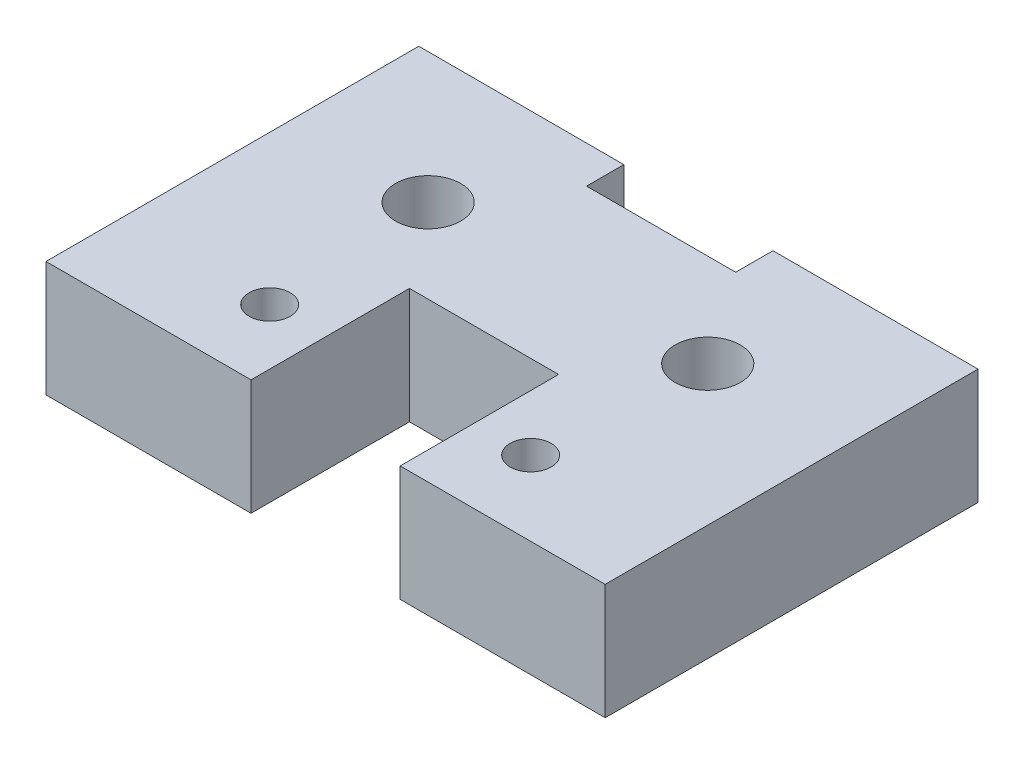
ISO-10303-21;
HEADER;
FILE_DESCRIPTION(('STEP AP214'),'2;1');
FILE_NAME('part.step','',(''),(''),'','','');
FILE_SCHEMA(('AUTOMOTIVE_DESIGN { 1 0 10303 214 1 1 1 1 }'));
ENDSEC;
DATA;
#1=APPLICATION_CONTEXT('core data for automotive mechanical design processes');
#2=APPLICATION_PROTOCOL_DEFINITION('international standard','automotive_design',2000,#1);
#3=PRODUCT_CONTEXT('',#1,'mechanical');
#4=PRODUCT('Part','Part','',(#3));
#5=PRODUCT_RELATED_PRODUCT_CATEGORY('part','',(#4));
#6=PRODUCT_DEFINITION_FORMATION('','',#4);
#7=PRODUCT_DEFINITION_CONTEXT('part definition',#1,'design');
#8=PRODUCT_DEFINITION('design','',#6,#7);
#9=PRODUCT_DEFINITION_SHAPE('','',#8);
#10=(LENGTH_UNIT() NAMED_UNIT(*) SI_UNIT(.MILLI.,.METRE.));
#11=(NAMED_UNIT(*) PLANE_ANGLE_UNIT() SI_UNIT($,.RADIAN.));
#12=(NAMED_UNIT(*) SI_UNIT($,.STERADIAN.) SOLID_ANGLE_UNIT());
#13=UNCERTAINTY_MEASURE_WITH_UNIT(LENGTH_MEASURE(1.E-05),#10,'distance_accuracy_value','');
#14=(GEOMETRIC_REPRESENTATION_CONTEXT(3) GLOBAL_UNCERTAINTY_ASSIGNED_CONTEXT((#13)) GLOBAL_UNIT_ASSIGNED_CONTEXT((#10,
#11,#12)) REPRESENTATION_CONTEXT('',''));
#15=CARTESIAN_POINT('',(0.,0.,0.));
#16=DIRECTION('',(0.,0.,1.));
#17=DIRECTION('',(1.,0.,0.));
#18=AXIS2_PLACEMENT_3D('',#15,#16,#17);
#19=CARTESIAN_POINT('',(0.,0.,0.));
#20=DIRECTION('',(0.,-1.,0.));
#21=DIRECTION('',(0.,0.,-1.));
#22=AXIS2_PLACEMENT_3D('',#19,#20,#21);
#23=PLANE('',#22);
#24=CARTESIAN_POINT('',(-7.,0.,6.));
#25=DIRECTION('',(0.,1.,0.));
#26=DIRECTION('',(0.,0.,1.));
#27=AXIS2_PLACEMENT_3D('',#24,#25,#26);
#28=CIRCLE('',#27,1.1);
#29=CARTESIAN_POINT('',(-7.,0.,7.1));
#30=VERTEX_POINT('',#29);
#31=EDGE_CURVE('E182',#30,#30,#28,.T.);
#32=ORIENTED_EDGE('',*,*,#31,.T.);
#33=EDGE_LOOP('',(#32));
#34=FACE_BOUND('',#33,.T.);
#35=CARTESIAN_POINT('',(7.,0.,6.));
#36=DIRECTION('',(0.,1.,0.));
#37=DIRECTION('',(0.,0.,-1.));
#38=AXIS2_PLACEMENT_3D('',#35,#36,#37);
#39=CIRCLE('',#38,1.1);
#40=CARTESIAN_POINT('',(7.,0.,4.9));
#41=VERTEX_POINT('',#40);
#42=EDGE_CURVE('E177',#41,#41,#39,.T.);
#43=ORIENTED_EDGE('',*,*,#42,.T.);
#44=EDGE_LOOP('',(#43));
#45=FACE_BOUND('',#44,.T.);
#46=DIRECTION('',(0.,0.,-1.));
#47=VECTOR('',#46,1.);
#48=CARTESIAN_POINT('',(4.,0.,-8.));
#49=LINE('',#48,#47);
#50=CARTESIAN_POINT('',(4.,0.,-8.));
#51=VERTEX_POINT('',#50);
#52=CARTESIAN_POINT('',(4.,0.,-10.));
#53=VERTEX_POINT('',#52);
#54=EDGE_CURVE('E191',#51,#53,#49,.T.);
#55=ORIENTED_EDGE('',*,*,#54,.T.);
#56=DIRECTION('',(-1.,0.,0.));
#57=VECTOR('',#56,1.);
#58=CARTESIAN_POINT('',(-15.,0.,-10.));
#59=LINE('',#58,#57);
#60=CARTESIAN_POINT('',(15.,0.,-10.));
#61=VERTEX_POINT('',#60);
#62=EDGE_CURVE('E272',#61,#53,#59,.T.);
#63=ORIENTED_EDGE('',*,*,#62,.F.);
#64=DIRECTION('',(0.,0.,-1.));
#65=VECTOR('',#64,1.);
#66=CARTESIAN_POINT('',(15.,0.,10.));
#67=LINE('',#66,#65);
#68=CARTESIAN_POINT('',(15.,0.,10.));
#69=VERTEX_POINT('',#68);
#70=EDGE_CURVE('E266',#69,#61,#67,.T.);
#71=ORIENTED_EDGE('',*,*,#70,.F.);
#72=DIRECTION('',(1.,0.,0.));
#73=VECTOR('',#72,1.);
#74=CARTESIAN_POINT('',(-15.,0.,10.));
#75=LINE('',#74,#73);
#76=CARTESIAN_POINT('',(4.,0.,10.));
#77=VERTEX_POINT('',#76);
#78=EDGE_CURVE('E277',#77,#69,#75,.T.);
#79=ORIENTED_EDGE('',*,*,#78,.F.);
#80=DIRECTION('',(0.,0.,-1.));
#81=VECTOR('',#80,1.);
#82=CARTESIAN_POINT('',(4.,0.,1.5));
#83=LINE('',#82,#81);
#84=CARTESIAN_POINT('',(4.,0.,1.5));
#85=VERTEX_POINT('',#84);
#86=EDGE_CURVE('E245',#77,#85,#83,.T.);
#87=ORIENTED_EDGE('',*,*,#86,.T.);
#88=DIRECTION('',(-1.,0.,0.));
#89=VECTOR('',#88,1.);
#90=CARTESIAN_POINT('',(-4.,0.,1.5));
#91=LINE('',#90,#89);
#92=CARTESIAN_POINT('',(-4.,0.,1.5));
#93=VERTEX_POINT('',#92);
#94=EDGE_CURVE('E248',#85,#93,#91,.T.);
#95=ORIENTED_EDGE('',*,*,#94,.T.);
#96=DIRECTION('',(0.,0.,1.));
#97=VECTOR('',#96,1.);
#98=CARTESIAN_POINT('',(-4.,0.,1.5));
#99=LINE('',#98,#97);
#100=CARTESIAN_POINT('',(-4.,0.,10.));
#101=VERTEX_POINT('',#100);
#102=EDGE_CURVE('E251',#93,#101,#99,.T.);
#103=ORIENTED_EDGE('',*,*,#102,.T.);
#104=CARTESIAN_POINT('',(-15.,0.,10.));
#105=VERTEX_POINT('',#104);
#106=EDGE_CURVE('E278',#105,#101,#75,.T.);
#107=ORIENTED_EDGE('',*,*,#106,.F.);
#108=DIRECTION('',(0.,0.,1.));
#109=VECTOR('',#108,1.);
#110=CARTESIAN_POINT('',(-15.,0.,10.));
#111=LINE('',#110,#109);
#112=CARTESIAN_POINT('',(-15.,0.,-10.));
#113=VERTEX_POINT('',#112);
#114=EDGE_CURVE('E275',#113,#105,#111,.T.);
#115=ORIENTED_EDGE('',*,*,#114,.F.);
#116=CARTESIAN_POINT('',(-4.,0.,-10.));
#117=VERTEX_POINT('',#116);
#118=EDGE_CURVE('E271',#117,#113,#59,.T.);
#119=ORIENTED_EDGE('',*,*,#118,.F.);
#120=DIRECTION('',(0.,0.,1.));
#121=VECTOR('',#120,1.);
#122=CARTESIAN_POINT('',(-4.,0.,-8.));
#123=LINE('',#122,#121);
#124=CARTESIAN_POINT('',(-4.,0.,-8.));
#125=VERTEX_POINT('',#124);
#126=EDGE_CURVE('E194',#117,#125,#123,.T.);
#127=ORIENTED_EDGE('',*,*,#126,.T.);
#128=DIRECTION('',(1.,0.,0.));
#129=VECTOR('',#128,1.);
#130=CARTESIAN_POINT('',(-4.,0.,-8.));
#131=LINE('',#130,#129);
#132=EDGE_CURVE('E198',#125,#51,#131,.T.);
#133=ORIENTED_EDGE('',*,*,#132,.T.);
#134=EDGE_LOOP('',(#55,#63,#71,#79,#87,#95,#103,#107,#115,#119,#127,#133));
#135=FACE_BOUND('',#134,.T.);
#136=CARTESIAN_POINT('',(-7.5,0.,-3.));
#137=DIRECTION('',(0.,1.,0.));
#138=DIRECTION('',(0.,0.,1.));
#139=AXIS2_PLACEMENT_3D('',#136,#137,#138);
#140=CIRCLE('',#139,3.05);
#141=CARTESIAN_POINT('',(-7.5,0.,0.0499999999999997));
#142=VERTEX_POINT('',#141);
#143=EDGE_CURVE('E263',#142,#142,#140,.T.);
#144=ORIENTED_EDGE('',*,*,#143,.T.);
#145=EDGE_LOOP('',(#144));
#146=FACE_BOUND('',#145,.T.);
#147=CARTESIAN_POINT('',(7.5,0.,-3.));
#148=DIRECTION('',(0.,1.,0.));
#149=DIRECTION('',(0.,0.,1.));
#150=AXIS2_PLACEMENT_3D('',#147,#148,#149);
#151=CIRCLE('',#150,3.05);
#152=CARTESIAN_POINT('',(7.5,0.,0.0499999999999962));
#153=VERTEX_POINT('',#152);
#154=EDGE_CURVE('E257',#153,#153,#151,.T.);
#155=ORIENTED_EDGE('',*,*,#154,.T.);
#156=EDGE_LOOP('',(#155));
#157=FACE_BOUND('',#156,.T.);
#158=DIRECTION('',(1.,0.,0.));
#159=VECTOR('',#158,1.);
#160=CARTESIAN_POINT('',(1.4,0.,-6.4));
#161=LINE('',#160,#159);
#162=CARTESIAN_POINT('',(-1.4,0.,-6.4));
#163=VERTEX_POINT('',#162);
#164=CARTESIAN_POINT('',(1.4,0.,-6.4));
#165=VERTEX_POINT('',#164);
#166=EDGE_CURVE('E401',#163,#165,#161,.T.);
#167=ORIENTED_EDGE('',*,*,#166,.F.);
#168=DIRECTION('',(0.,0.,-1.));
#169=VECTOR('',#168,1.);
#170=CARTESIAN_POINT('',(-1.4,0.,-3.6));
#171=LINE('',#170,#169);
#172=CARTESIAN_POINT('',(-1.4,0.,-3.6));
#173=VERTEX_POINT('',#172);
#174=EDGE_CURVE('E172',#173,#163,#171,.T.);
#175=ORIENTED_EDGE('',*,*,#174,.F.);
#176=DIRECTION('',(-1.,0.,0.));
#177=VECTOR('',#176,1.);
#178=CARTESIAN_POINT('',(1.4,0.,-3.6));
#179=LINE('',#178,#177);
#180=CARTESIAN_POINT('',(1.4,0.,-3.6));
#181=VERTEX_POINT('',#180);
#182=EDGE_CURVE('E168',#181,#173,#179,.T.);
#183=ORIENTED_EDGE('',*,*,#182,.F.);
#184=DIRECTION('',(0.,0.,1.));
#185=VECTOR('',#184,1.);
#186=CARTESIAN_POINT('',(1.4,0.,-3.6));
#187=LINE('',#186,#185);
#188=EDGE_CURVE('E403',#165,#181,#187,.T.);
#189=ORIENTED_EDGE('',*,*,#188,.F.);
#190=EDGE_LOOP('',(#167,#175,#183,#189));
#191=FACE_BOUND('',#190,.T.);
#192=ADVANCED_FACE('F35',(#34,#45,#135,#146,#157,#191),#23,.T.);
#193=CARTESIAN_POINT('',(-15.,4.2,-10.));
#194=DIRECTION('',(0.,0.,1.));
#195=DIRECTION('',(1.,0.,0.));
#196=AXIS2_PLACEMENT_3D('',#193,#194,#195);
#197=PLANE('',#196);
#198=ORIENTED_EDGE('',*,*,#62,.T.);
#199=DIRECTION('',(0.,1.,0.));
#200=VECTOR('',#199,1.);
#201=CARTESIAN_POINT('',(4.,0.,-10.));
#202=LINE('',#201,#200);
#203=CARTESIAN_POINT('',(4.,6.2,-10.));
#204=VERTEX_POINT('',#203);
#205=EDGE_CURVE('E201',#53,#204,#202,.T.);
#206=ORIENTED_EDGE('',*,*,#205,.T.);
#207=DIRECTION('',(-1.,0.,0.));
#208=VECTOR('',#207,1.);
#209=CARTESIAN_POINT('',(15.,6.2,-10.));
#210=LINE('',#209,#208);
#211=CARTESIAN_POINT('',(15.,6.2,-10.));
#212=VERTEX_POINT('',#211);
#213=EDGE_CURVE('E236',#212,#204,#210,.T.);
#214=ORIENTED_EDGE('',*,*,#213,.F.);
#215=DIRECTION('',(0.,-1.,0.));
#216=VECTOR('',#215,1.);
#217=CARTESIAN_POINT('',(15.,4.2,-10.));
#218=LINE('',#217,#216);
#219=EDGE_CURVE('E11',#212,#61,#218,.T.);
#220=ORIENTED_EDGE('',*,*,#219,.T.);
#221=EDGE_LOOP('',(#198,#206,#214,#220));
#222=FACE_BOUND('',#221,.T.);
#223=ADVANCED_FACE('F307',(#222),#197,.F.);
#224=CARTESIAN_POINT('',(-15.,4.2,10.));
#225=DIRECTION('',(0.,0.,-1.));
#226=DIRECTION('',(-1.,0.,0.));
#227=AXIS2_PLACEMENT_3D('',#224,#225,#226);
#228=PLANE('',#227);
#229=DIRECTION('',(0.,-1.,0.));
#230=VECTOR('',#229,1.);
#231=CARTESIAN_POINT('',(15.,4.2,10.));
#232=LINE('',#231,#230);
#233=CARTESIAN_POINT('',(15.,6.2,10.));
#234=VERTEX_POINT('',#233);
#235=EDGE_CURVE('E281',#234,#69,#232,.T.);
#236=ORIENTED_EDGE('',*,*,#235,.F.);
#237=DIRECTION('',(1.,0.,0.));
#238=VECTOR('',#237,1.);
#239=CARTESIAN_POINT('',(4.,6.2,10.));
#240=LINE('',#239,#238);
#241=CARTESIAN_POINT('',(4.,6.2,10.));
#242=VERTEX_POINT('',#241);
#243=EDGE_CURVE('E229',#242,#234,#240,.T.);
#244=ORIENTED_EDGE('',*,*,#243,.F.);
#245=DIRECTION('',(0.,1.,0.));
#246=VECTOR('',#245,1.);
#247=CARTESIAN_POINT('',(4.,0.,10.));
#248=LINE('',#247,#246);
#249=EDGE_CURVE('E255',#77,#242,#248,.T.);
#250=ORIENTED_EDGE('',*,*,#249,.F.);
#251=ORIENTED_EDGE('',*,*,#78,.T.);
#252=EDGE_LOOP('',(#236,#244,#250,#251));
#253=FACE_BOUND('',#252,.T.);
#254=ADVANCED_FACE('F313',(#253),#228,.F.);
#255=CARTESIAN_POINT('',(15.,4.2,10.));
#256=DIRECTION('',(-1.,0.,0.));
#257=DIRECTION('',(0.,0.,1.));
#258=AXIS2_PLACEMENT_3D('',#255,#256,#257);
#259=PLANE('',#258);
#260=ORIENTED_EDGE('',*,*,#70,.T.);
#261=ORIENTED_EDGE('',*,*,#219,.F.);
#262=DIRECTION('',(0.,0.,-1.));
#263=VECTOR('',#262,1.);
#264=CARTESIAN_POINT('',(15.,6.2,10.));
#265=LINE('',#264,#263);
#266=EDGE_CURVE('E232',#234,#212,#265,.T.);
#267=ORIENTED_EDGE('',*,*,#266,.F.);
#268=ORIENTED_EDGE('',*,*,#235,.T.);
#269=EDGE_LOOP('',(#260,#261,#267,#268));
#270=FACE_BOUND('',#269,.T.);
#271=ADVANCED_FACE('F37',(#270),#259,.F.);
#272=CARTESIAN_POINT('',(-4.,6.2,-10.));
#273=VERTEX_POINT('',#272);
#274=CARTESIAN_POINT('',(-15.,6.2,-10.));
#275=VERTEX_POINT('',#274);
#276=EDGE_CURVE('E235',#273,#275,#210,.T.);
#277=ORIENTED_EDGE('',*,*,#276,.F.);
#278=DIRECTION('',(0.,1.,0.));
#279=VECTOR('',#278,1.);
#280=CARTESIAN_POINT('',(-4.,0.,-10.));
#281=LINE('',#280,#279);
#282=EDGE_CURVE('E58',#117,#273,#281,.T.);
#283=ORIENTED_EDGE('',*,*,#282,.F.);
#284=ORIENTED_EDGE('',*,*,#118,.T.);
#285=DIRECTION('',(0.,-1.,0.));
#286=VECTOR('',#285,1.);
#287=CARTESIAN_POINT('',(-15.,4.2,-10.));
#288=LINE('',#287,#286);
#289=EDGE_CURVE('E43',#275,#113,#288,.T.);
#290=ORIENTED_EDGE('',*,*,#289,.F.);
#291=EDGE_LOOP('',(#277,#283,#284,#290));
#292=FACE_BOUND('',#291,.T.);
#293=ADVANCED_FACE('F305',(#292),#197,.F.);
#294=CARTESIAN_POINT('',(-15.,4.2,10.));
#295=DIRECTION('',(1.,0.,0.));
#296=DIRECTION('',(0.,0.,-1.));
#297=AXIS2_PLACEMENT_3D('',#294,#295,#296);
#298=PLANE('',#297);
#299=ORIENTED_EDGE('',*,*,#114,.T.);
#300=DIRECTION('',(0.,-1.,0.));
#301=VECTOR('',#300,1.);
#302=CARTESIAN_POINT('',(-15.,4.2,10.));
#303=LINE('',#302,#301);
#304=CARTESIAN_POINT('',(-15.,6.2,10.));
#305=VERTEX_POINT('',#304);
#306=EDGE_CURVE('E284',#305,#105,#303,.T.);
#307=ORIENTED_EDGE('',*,*,#306,.F.);
#308=DIRECTION('',(0.,0.,1.));
#309=VECTOR('',#308,1.);
#310=CARTESIAN_POINT('',(-15.,6.2,-10.));
#311=LINE('',#310,#309);
#312=EDGE_CURVE('E239',#275,#305,#311,.T.);
#313=ORIENTED_EDGE('',*,*,#312,.F.);
#314=ORIENTED_EDGE('',*,*,#289,.T.);
#315=EDGE_LOOP('',(#299,#307,#313,#314));
#316=FACE_BOUND('',#315,.T.);
#317=ADVANCED_FACE('F291',(#316),#298,.F.);
#318=ORIENTED_EDGE('',*,*,#106,.T.);
#319=DIRECTION('',(0.,1.,0.));
#320=VECTOR('',#319,1.);
#321=CARTESIAN_POINT('',(-4.,0.,10.));
#322=LINE('',#321,#320);
#323=CARTESIAN_POINT('',(-4.,6.2,10.));
#324=VERTEX_POINT('',#323);
#325=EDGE_CURVE('E258',#101,#324,#322,.T.);
#326=ORIENTED_EDGE('',*,*,#325,.T.);
#327=DIRECTION('',(1.,0.,0.));
#328=VECTOR('',#327,1.);
#329=CARTESIAN_POINT('',(-15.,6.2,10.));
#330=LINE('',#329,#328);
#331=EDGE_CURVE('E242',#305,#324,#330,.T.);
#332=ORIENTED_EDGE('',*,*,#331,.F.);
#333=ORIENTED_EDGE('',*,*,#306,.T.);
#334=EDGE_LOOP('',(#318,#326,#332,#333));
#335=FACE_BOUND('',#334,.T.);
#336=ADVANCED_FACE('F299',(#335),#228,.F.);
#337=CARTESIAN_POINT('',(7.5,0.,-3.));
#338=DIRECTION('',(0.,1.,0.));
#339=DIRECTION('',(0.,0.,1.));
#340=AXIS2_PLACEMENT_3D('',#337,#338,#339);
#341=CYLINDRICAL_SURFACE('',#340,3.05);
#342=CARTESIAN_POINT('',(7.5,0.400000000000001,-3.));
#343=DIRECTION('',(0.,-1.,0.));
#344=DIRECTION('',(0.,0.,-1.));
#345=AXIS2_PLACEMENT_3D('',#342,#343,#344);
#346=CIRCLE('',#345,3.05);
#347=CARTESIAN_POINT('',(7.5,0.400000000000001,-6.05));
#348=VERTEX_POINT('',#347);
#349=EDGE_CURVE('E406',#348,#348,#346,.T.);
#350=ORIENTED_EDGE('',*,*,#349,.F.);
#351=EDGE_LOOP('',(#350));
#352=FACE_BOUND('',#351,.T.);
#353=ORIENTED_EDGE('',*,*,#154,.F.);
#354=EDGE_LOOP('',(#353));
#355=FACE_BOUND('',#354,.T.);
#356=ADVANCED_FACE('F325',(#352,#355),#341,.F.);
#357=CARTESIAN_POINT('',(-7.5,0.,-3.));
#358=DIRECTION('',(0.,1.,0.));
#359=DIRECTION('',(0.,0.,1.));
#360=AXIS2_PLACEMENT_3D('',#357,#358,#359);
#361=CYLINDRICAL_SURFACE('',#360,3.05);
#362=CARTESIAN_POINT('',(-7.5,0.400000000000001,-3.));
#363=DIRECTION('',(0.,-1.,0.));
#364=DIRECTION('',(0.,0.,-1.));
#365=AXIS2_PLACEMENT_3D('',#362,#363,#364);
#366=CIRCLE('',#365,3.05);
#367=CARTESIAN_POINT('',(-7.5,0.400000000000001,-6.05));
#368=VERTEX_POINT('',#367);
#369=EDGE_CURVE('E395',#368,#368,#366,.T.);
#370=ORIENTED_EDGE('',*,*,#369,.F.);
#371=EDGE_LOOP('',(#370));
#372=FACE_BOUND('',#371,.T.);
#373=ORIENTED_EDGE('',*,*,#143,.F.);
#374=EDGE_LOOP('',(#373));
#375=FACE_BOUND('',#374,.T.);
#376=ADVANCED_FACE('F331',(#372,#375),#361,.F.);
#377=CARTESIAN_POINT('',(4.,0.,1.5));
#378=DIRECTION('',(1.,0.,0.));
#379=DIRECTION('',(0.,0.,-1.));
#380=AXIS2_PLACEMENT_3D('',#377,#378,#379);
#381=PLANE('',#380);
#382=ORIENTED_EDGE('',*,*,#249,.T.);
#383=DIRECTION('',(0.,0.,1.));
#384=VECTOR('',#383,1.);
#385=CARTESIAN_POINT('',(4.,6.2,1.5));
#386=LINE('',#385,#384);
#387=CARTESIAN_POINT('',(4.,6.2,1.5));
#388=VERTEX_POINT('',#387);
#389=EDGE_CURVE('E226',#388,#242,#386,.T.);
#390=ORIENTED_EDGE('',*,*,#389,.F.);
#391=DIRECTION('',(0.,1.,0.));
#392=VECTOR('',#391,1.);
#393=CARTESIAN_POINT('',(4.,0.,1.5));
#394=LINE('',#393,#392);
#395=EDGE_CURVE('E254',#85,#388,#394,.T.);
#396=ORIENTED_EDGE('',*,*,#395,.F.);
#397=ORIENTED_EDGE('',*,*,#86,.F.);
#398=EDGE_LOOP('',(#382,#390,#396,#397));
#399=FACE_BOUND('',#398,.T.);
#400=ADVANCED_FACE('F381',(#399),#381,.F.);
#401=CARTESIAN_POINT('',(-4.,0.,1.5));
#402=DIRECTION('',(-1.,0.,0.));
#403=DIRECTION('',(0.,0.,1.));
#404=AXIS2_PLACEMENT_3D('',#401,#402,#403);
#405=PLANE('',#404);
#406=DIRECTION('',(0.,1.,0.));
#407=VECTOR('',#406,1.);
#408=CARTESIAN_POINT('',(-4.,0.,1.5));
#409=LINE('',#408,#407);
#410=CARTESIAN_POINT('',(-4.,6.2,1.5));
#411=VERTEX_POINT('',#410);
#412=EDGE_CURVE('E260',#93,#411,#409,.T.);
#413=ORIENTED_EDGE('',*,*,#412,.T.);
#414=DIRECTION('',(0.,0.,-1.));
#415=VECTOR('',#414,1.);
#416=CARTESIAN_POINT('',(-4.,6.2,10.));
#417=LINE('',#416,#415);
#418=EDGE_CURVE('E218',#324,#411,#417,.T.);
#419=ORIENTED_EDGE('',*,*,#418,.F.);
#420=ORIENTED_EDGE('',*,*,#325,.F.);
#421=ORIENTED_EDGE('',*,*,#102,.F.);
#422=EDGE_LOOP('',(#413,#419,#420,#421));
#423=FACE_BOUND('',#422,.T.);
#424=ADVANCED_FACE('F378',(#423),#405,.F.);
#425=CARTESIAN_POINT('',(-4.,0.,1.5));
#426=DIRECTION('',(0.,0.,-1.));
#427=DIRECTION('',(-1.,0.,0.));
#428=AXIS2_PLACEMENT_3D('',#425,#426,#427);
#429=PLANE('',#428);
#430=ORIENTED_EDGE('',*,*,#395,.T.);
#431=DIRECTION('',(1.,0.,0.));
#432=VECTOR('',#431,1.);
#433=CARTESIAN_POINT('',(-4.,6.2,1.5));
#434=LINE('',#433,#432);
#435=EDGE_CURVE('E223',#411,#388,#434,.T.);
#436=ORIENTED_EDGE('',*,*,#435,.F.);
#437=ORIENTED_EDGE('',*,*,#412,.F.);
#438=ORIENTED_EDGE('',*,*,#94,.F.);
#439=EDGE_LOOP('',(#430,#436,#437,#438));
#440=FACE_BOUND('',#439,.T.);
#441=ADVANCED_FACE('F376',(#440),#429,.F.);
#442=CARTESIAN_POINT('',(0.,6.2,0.));
#443=DIRECTION('',(0.,-1.,0.));
#444=DIRECTION('',(0.,0.,-1.));
#445=AXIS2_PLACEMENT_3D('',#442,#443,#444);
#446=PLANE('',#445);
#447=CARTESIAN_POINT('',(-7.,6.2,6.));
#448=DIRECTION('',(0.,1.,0.));
#449=DIRECTION('',(0.,0.,1.));
#450=AXIS2_PLACEMENT_3D('',#447,#448,#449);
#451=CIRCLE('',#450,1.1);
#452=CARTESIAN_POINT('',(-7.,6.2,7.1));
#453=VERTEX_POINT('',#452);
#454=EDGE_CURVE('E186',#453,#453,#451,.T.);
#455=ORIENTED_EDGE('',*,*,#454,.F.);
#456=EDGE_LOOP('',(#455));
#457=FACE_BOUND('',#456,.T.);
#458=CARTESIAN_POINT('',(7.,6.2,6.));
#459=DIRECTION('',(0.,1.,0.));
#460=DIRECTION('',(0.,0.,-1.));
#461=AXIS2_PLACEMENT_3D('',#458,#459,#460);
#462=CIRCLE('',#461,1.1);
#463=CARTESIAN_POINT('',(7.,6.2,4.9));
#464=VERTEX_POINT('',#463);
#465=EDGE_CURVE('E174',#464,#464,#462,.T.);
#466=ORIENTED_EDGE('',*,*,#465,.F.);
#467=EDGE_LOOP('',(#466));
#468=FACE_BOUND('',#467,.T.);
#469=CARTESIAN_POINT('',(-7.5,6.2,-3.));
#470=DIRECTION('',(0.,-1.,0.));
#471=DIRECTION('',(0.,0.,-1.));
#472=AXIS2_PLACEMENT_3D('',#469,#470,#471);
#473=CIRCLE('',#472,1.75);
#474=CARTESIAN_POINT('',(-7.5,6.2,-4.75));
#475=VERTEX_POINT('',#474);
#476=EDGE_CURVE('E215',#475,#475,#473,.T.);
#477=ORIENTED_EDGE('',*,*,#476,.T.);
#478=EDGE_LOOP('',(#477));
#479=FACE_BOUND('',#478,.T.);
#480=CARTESIAN_POINT('',(7.5,6.2,-3.));
#481=DIRECTION('',(0.,-1.,0.));
#482=DIRECTION('',(0.,0.,-1.));
#483=AXIS2_PLACEMENT_3D('',#480,#481,#482);
#484=CIRCLE('',#483,1.75);
#485=CARTESIAN_POINT('',(7.5,6.2,-4.75));
#486=VERTEX_POINT('',#485);
#487=EDGE_CURVE('E209',#486,#486,#484,.T.);
#488=ORIENTED_EDGE('',*,*,#487,.T.);
#489=EDGE_LOOP('',(#488));
#490=FACE_BOUND('',#489,.T.);
#491=ORIENTED_EDGE('',*,*,#213,.T.);
#492=DIRECTION('',(0.,0.,-1.));
#493=VECTOR('',#492,1.);
#494=CARTESIAN_POINT('',(4.,6.2,-8.));
#495=LINE('',#494,#493);
#496=CARTESIAN_POINT('',(4.,6.2,-8.));
#497=VERTEX_POINT('',#496);
#498=EDGE_CURVE('E185',#497,#204,#495,.T.);
#499=ORIENTED_EDGE('',*,*,#498,.F.);
#500=DIRECTION('',(1.,0.,0.));
#501=VECTOR('',#500,1.);
#502=CARTESIAN_POINT('',(-4.,6.2,-8.));
#503=LINE('',#502,#501);
#504=CARTESIAN_POINT('',(-4.,6.2,-8.));
#505=VERTEX_POINT('',#504);
#506=EDGE_CURVE('E195',#505,#497,#503,.T.);
#507=ORIENTED_EDGE('',*,*,#506,.F.);
#508=DIRECTION('',(0.,0.,1.));
#509=VECTOR('',#508,1.);
#510=CARTESIAN_POINT('',(-4.,6.2,-8.));
#511=LINE('',#510,#509);
#512=EDGE_CURVE('E203',#273,#505,#511,.T.);
#513=ORIENTED_EDGE('',*,*,#512,.F.);
#514=ORIENTED_EDGE('',*,*,#276,.T.);
#515=ORIENTED_EDGE('',*,*,#312,.T.);
#516=ORIENTED_EDGE('',*,*,#331,.T.);
#517=ORIENTED_EDGE('',*,*,#418,.T.);
#518=ORIENTED_EDGE('',*,*,#435,.T.);
#519=ORIENTED_EDGE('',*,*,#389,.T.);
#520=ORIENTED_EDGE('',*,*,#243,.T.);
#521=ORIENTED_EDGE('',*,*,#266,.T.);
#522=EDGE_LOOP('',(#491,#499,#507,#513,#514,#515,#516,#517,#518,#519,#520,#521));
#523=FACE_BOUND('',#522,.T.);
#524=ADVANCED_FACE('F302',(#457,#468,#479,#490,#523),#446,.F.);
#525=CARTESIAN_POINT('',(7.5,6.2,-3.));
#526=DIRECTION('',(0.,-1.,0.));
#527=DIRECTION('',(0.,0.,-1.));
#528=AXIS2_PLACEMENT_3D('',#525,#526,#527);
#529=CYLINDRICAL_SURFACE('',#528,1.75);
#530=ORIENTED_EDGE('',*,*,#487,.F.);
#531=EDGE_LOOP('',(#530));
#532=FACE_BOUND('',#531,.T.);
#533=CARTESIAN_POINT('',(7.5,0.400000000000001,-3.));
#534=DIRECTION('',(0.,-1.,0.));
#535=DIRECTION('',(0.,0.,-1.));
#536=AXIS2_PLACEMENT_3D('',#533,#534,#535);
#537=CIRCLE('',#536,1.75);
#538=CARTESIAN_POINT('',(7.5,0.400000000000001,-4.75));
#539=VERTEX_POINT('',#538);
#540=EDGE_CURVE('E416',#539,#539,#537,.T.);
#541=ORIENTED_EDGE('',*,*,#540,.T.);
#542=EDGE_LOOP('',(#541));
#543=FACE_BOUND('',#542,.T.);
#544=ADVANCED_FACE('F369',(#532,#543),#529,.F.);
#545=CARTESIAN_POINT('',(-7.5,6.2,-3.));
#546=DIRECTION('',(0.,-1.,0.));
#547=DIRECTION('',(0.,0.,-1.));
#548=AXIS2_PLACEMENT_3D('',#545,#546,#547);
#549=CYLINDRICAL_SURFACE('',#548,1.75);
#550=ORIENTED_EDGE('',*,*,#476,.F.);
#551=EDGE_LOOP('',(#550));
#552=FACE_BOUND('',#551,.T.);
#553=CARTESIAN_POINT('',(-7.5,0.400000000000001,-3.));
#554=DIRECTION('',(0.,-1.,0.));
#555=DIRECTION('',(0.,0.,-1.));
#556=AXIS2_PLACEMENT_3D('',#553,#554,#555);
#557=CIRCLE('',#556,1.75);
#558=CARTESIAN_POINT('',(-7.5,0.400000000000001,-4.75));
#559=VERTEX_POINT('',#558);
#560=EDGE_CURVE('E420',#559,#559,#557,.T.);
#561=ORIENTED_EDGE('',*,*,#560,.T.);
#562=EDGE_LOOP('',(#561));
#563=FACE_BOUND('',#562,.T.);
#564=ADVANCED_FACE('F366',(#552,#563),#549,.F.);
#565=CARTESIAN_POINT('',(4.,0.,-8.));
#566=DIRECTION('',(1.,0.,0.));
#567=DIRECTION('',(0.,0.,-1.));
#568=AXIS2_PLACEMENT_3D('',#565,#566,#567);
#569=PLANE('',#568);
#570=ORIENTED_EDGE('',*,*,#498,.T.);
#571=ORIENTED_EDGE('',*,*,#205,.F.);
#572=ORIENTED_EDGE('',*,*,#54,.F.);
#573=DIRECTION('',(0.,1.,0.));
#574=VECTOR('',#573,1.);
#575=CARTESIAN_POINT('',(4.,0.,-8.));
#576=LINE('',#575,#574);
#577=EDGE_CURVE('E207',#51,#497,#576,.T.);
#578=ORIENTED_EDGE('',*,*,#577,.T.);
#579=EDGE_LOOP('',(#570,#571,#572,#578));
#580=FACE_BOUND('',#579,.T.);
#581=ADVANCED_FACE('F346',(#580),#569,.F.);
#582=CARTESIAN_POINT('',(-4.,0.,-8.));
#583=DIRECTION('',(0.,0.,1.));
#584=DIRECTION('',(1.,0.,0.));
#585=AXIS2_PLACEMENT_3D('',#582,#583,#584);
#586=PLANE('',#585);
#587=ORIENTED_EDGE('',*,*,#506,.T.);
#588=ORIENTED_EDGE('',*,*,#577,.F.);
#589=ORIENTED_EDGE('',*,*,#132,.F.);
#590=DIRECTION('',(0.,1.,0.));
#591=VECTOR('',#590,1.);
#592=CARTESIAN_POINT('',(-4.,0.,-8.));
#593=LINE('',#592,#591);
#594=EDGE_CURVE('E210',#125,#505,#593,.T.);
#595=ORIENTED_EDGE('',*,*,#594,.T.);
#596=EDGE_LOOP('',(#587,#588,#589,#595));
#597=FACE_BOUND('',#596,.T.);
#598=ADVANCED_FACE('F350',(#597),#586,.F.);
#599=CARTESIAN_POINT('',(-4.,0.,-8.));
#600=DIRECTION('',(-1.,0.,0.));
#601=DIRECTION('',(0.,0.,1.));
#602=AXIS2_PLACEMENT_3D('',#599,#600,#601);
#603=PLANE('',#602);
#604=ORIENTED_EDGE('',*,*,#512,.T.);
#605=ORIENTED_EDGE('',*,*,#594,.F.);
#606=ORIENTED_EDGE('',*,*,#126,.F.);
#607=ORIENTED_EDGE('',*,*,#282,.T.);
#608=EDGE_LOOP('',(#604,#605,#606,#607));
#609=FACE_BOUND('',#608,.T.);
#610=ADVANCED_FACE('F351',(#609),#603,.F.);
#611=CARTESIAN_POINT('',(7.,0.,6.));
#612=DIRECTION('',(0.,1.,0.));
#613=DIRECTION('',(0.,0.,1.));
#614=AXIS2_PLACEMENT_3D('',#611,#612,#613);
#615=CYLINDRICAL_SURFACE('',#614,1.1);
#616=ORIENTED_EDGE('',*,*,#42,.F.);
#617=EDGE_LOOP('',(#616));
#618=FACE_BOUND('',#617,.T.);
#619=ORIENTED_EDGE('',*,*,#465,.T.);
#620=EDGE_LOOP('',(#619));
#621=FACE_BOUND('',#620,.T.);
#622=ADVANCED_FACE('F353',(#618,#621),#615,.F.);
#623=CARTESIAN_POINT('',(-7.,0.,6.));
#624=DIRECTION('',(0.,1.,0.));
#625=DIRECTION('',(0.,0.,1.));
#626=AXIS2_PLACEMENT_3D('',#623,#624,#625);
#627=CYLINDRICAL_SURFACE('',#626,1.1);
#628=ORIENTED_EDGE('',*,*,#31,.F.);
#629=EDGE_LOOP('',(#628));
#630=FACE_BOUND('',#629,.T.);
#631=ORIENTED_EDGE('',*,*,#454,.T.);
#632=EDGE_LOOP('',(#631));
#633=FACE_BOUND('',#632,.T.);
#634=ADVANCED_FACE('F359',(#630,#633),#627,.F.);
#635=CARTESIAN_POINT('',(-1.4,-3.,-3.6));
#636=DIRECTION('',(1.,0.,0.));
#637=DIRECTION('',(0.,0.,-1.));
#638=AXIS2_PLACEMENT_3D('',#635,#636,#637);
#639=PLANE('',#638);
#640=ORIENTED_EDGE('',*,*,#174,.T.);
#641=DIRECTION('',(0.,1.,0.));
#642=VECTOR('',#641,1.);
#643=CARTESIAN_POINT('',(-1.4,-3.,-6.4));
#644=LINE('',#643,#642);
#645=CARTESIAN_POINT('',(-1.4,-3.,-6.4));
#646=VERTEX_POINT('',#645);
#647=EDGE_CURVE('E153',#646,#163,#644,.T.);
#648=ORIENTED_EDGE('',*,*,#647,.F.);
#649=DIRECTION('',(0.,0.,-1.));
#650=VECTOR('',#649,1.);
#651=CARTESIAN_POINT('',(-1.4,-3.,-3.6));
#652=LINE('',#651,#650);
#653=CARTESIAN_POINT('',(-1.4,-3.,-3.6));
#654=VERTEX_POINT('',#653);
#655=EDGE_CURVE('E160',#654,#646,#652,.T.);
#656=ORIENTED_EDGE('',*,*,#655,.F.);
#657=DIRECTION('',(0.,1.,0.));
#658=VECTOR('',#657,1.);
#659=CARTESIAN_POINT('',(-1.4,-3.,-3.6));
#660=LINE('',#659,#658);
#661=EDGE_CURVE('E411',#654,#173,#660,.T.);
#662=ORIENTED_EDGE('',*,*,#661,.T.);
#663=EDGE_LOOP('',(#640,#648,#656,#662));
#664=FACE_BOUND('',#663,.T.);
#665=ADVANCED_FACE('F170',(#664),#639,.F.);
#666=CARTESIAN_POINT('',(1.4,-3.,-6.4));
#667=DIRECTION('',(0.,0.,1.));
#668=DIRECTION('',(1.,0.,0.));
#669=AXIS2_PLACEMENT_3D('',#666,#667,#668);
#670=PLANE('',#669);
#671=ORIENTED_EDGE('',*,*,#166,.T.);
#672=DIRECTION('',(0.,1.,0.));
#673=VECTOR('',#672,1.);
#674=CARTESIAN_POINT('',(1.4,-3.,-6.4));
#675=LINE('',#674,#673);
#676=CARTESIAN_POINT('',(1.4,-3.,-6.4));
#677=VERTEX_POINT('',#676);
#678=EDGE_CURVE('E156',#677,#165,#675,.T.);
#679=ORIENTED_EDGE('',*,*,#678,.F.);
#680=DIRECTION('',(1.,0.,0.));
#681=VECTOR('',#680,1.);
#682=CARTESIAN_POINT('',(1.4,-3.,-6.4));
#683=LINE('',#682,#681);
#684=EDGE_CURVE('E149',#646,#677,#683,.T.);
#685=ORIENTED_EDGE('',*,*,#684,.F.);
#686=ORIENTED_EDGE('',*,*,#647,.T.);
#687=EDGE_LOOP('',(#671,#679,#685,#686));
#688=FACE_BOUND('',#687,.T.);
#689=ADVANCED_FACE('F151',(#688),#670,.F.);
#690=CARTESIAN_POINT('',(1.4,-3.,-3.6));
#691=DIRECTION('',(-1.,0.,0.));
#692=DIRECTION('',(0.,0.,1.));
#693=AXIS2_PLACEMENT_3D('',#690,#691,#692);
#694=PLANE('',#693);
#695=ORIENTED_EDGE('',*,*,#188,.T.);
#696=DIRECTION('',(0.,1.,0.));
#697=VECTOR('',#696,1.);
#698=CARTESIAN_POINT('',(1.4,-3.,-3.6));
#699=LINE('',#698,#697);
#700=CARTESIAN_POINT('',(1.4,-3.,-3.6));
#701=VERTEX_POINT('',#700);
#702=EDGE_CURVE('E50',#701,#181,#699,.T.);
#703=ORIENTED_EDGE('',*,*,#702,.F.);
#704=DIRECTION('',(0.,0.,1.));
#705=VECTOR('',#704,1.);
#706=CARTESIAN_POINT('',(1.4,-3.,-3.6));
#707=LINE('',#706,#705);
#708=EDGE_CURVE('E159',#677,#701,#707,.T.);
#709=ORIENTED_EDGE('',*,*,#708,.F.);
#710=ORIENTED_EDGE('',*,*,#678,.T.);
#711=EDGE_LOOP('',(#695,#703,#709,#710));
#712=FACE_BOUND('',#711,.T.);
#713=ADVANCED_FACE('F441',(#712),#694,.F.);
#714=CARTESIAN_POINT('',(1.4,-3.,-3.6));
#715=DIRECTION('',(0.,0.,-1.));
#716=DIRECTION('',(-1.,0.,0.));
#717=AXIS2_PLACEMENT_3D('',#714,#715,#716);
#718=PLANE('',#717);
#719=ORIENTED_EDGE('',*,*,#182,.T.);
#720=ORIENTED_EDGE('',*,*,#661,.F.);
#721=DIRECTION('',(-1.,0.,0.));
#722=VECTOR('',#721,1.);
#723=CARTESIAN_POINT('',(1.4,-3.,-3.6));
#724=LINE('',#723,#722);
#725=EDGE_CURVE('E164',#701,#654,#724,.T.);
#726=ORIENTED_EDGE('',*,*,#725,.F.);
#727=ORIENTED_EDGE('',*,*,#702,.T.);
#728=EDGE_LOOP('',(#719,#720,#726,#727));
#729=FACE_BOUND('',#728,.T.);
#730=ADVANCED_FACE('F438',(#729),#718,.F.);
#731=CARTESIAN_POINT('',(0.,-3.,0.));
#732=DIRECTION('',(0.,1.,0.));
#733=DIRECTION('',(0.,0.,1.));
#734=AXIS2_PLACEMENT_3D('',#731,#732,#733);
#735=PLANE('',#734);
#736=ORIENTED_EDGE('',*,*,#655,.T.);
#737=ORIENTED_EDGE('',*,*,#684,.T.);
#738=ORIENTED_EDGE('',*,*,#708,.T.);
#739=ORIENTED_EDGE('',*,*,#725,.T.);
#740=EDGE_LOOP('',(#736,#737,#738,#739));
#741=FACE_BOUND('',#740,.T.);
#742=ADVANCED_FACE('F163',(#741),#735,.F.);
#743=CARTESIAN_POINT('',(7.5,0.400000000000001,-3.));
#744=DIRECTION('',(0.,-1.,0.));
#745=DIRECTION('',(0.,0.,-1.));
#746=AXIS2_PLACEMENT_3D('',#743,#744,#745);
#747=PLANE('',#746);
#748=ORIENTED_EDGE('',*,*,#349,.T.);
#749=EDGE_LOOP('',(#748));
#750=FACE_BOUND('',#749,.T.);
#751=ORIENTED_EDGE('',*,*,#540,.F.);
#752=EDGE_LOOP('',(#751));
#753=FACE_BOUND('',#752,.T.);
#754=ADVANCED_FACE('F427',(#750,#753),#747,.T.);
#755=CARTESIAN_POINT('',(-7.5,0.400000000000001,-3.));
#756=DIRECTION('',(0.,-1.,0.));
#757=DIRECTION('',(0.,0.,-1.));
#758=AXIS2_PLACEMENT_3D('',#755,#756,#757);
#759=PLANE('',#758);
#760=ORIENTED_EDGE('',*,*,#369,.T.);
#761=EDGE_LOOP('',(#760));
#762=FACE_BOUND('',#761,.T.);
#763=ORIENTED_EDGE('',*,*,#560,.F.);
#764=EDGE_LOOP('',(#763));
#765=FACE_BOUND('',#764,.T.);
#766=ADVANCED_FACE('F425',(#762,#765),#759,.T.);
#767=CLOSED_SHELL('',(#192,#223,#254,#271,#293,#317,#336,#356,#376,#400,#424,#441,#524,#544,
#564,#581,#598,#610,#622,#634,#665,#689,#713,#730,#742,#754,#766));
#768=MANIFOLD_SOLID_BREP('B2',#767);
#769=ADVANCED_BREP_SHAPE_REPRESENTATION('',(#18,#768),#14);
#770=SHAPE_DEFINITION_REPRESENTATION(#9,#769);
ENDSEC;
END-ISO-10303-21;
